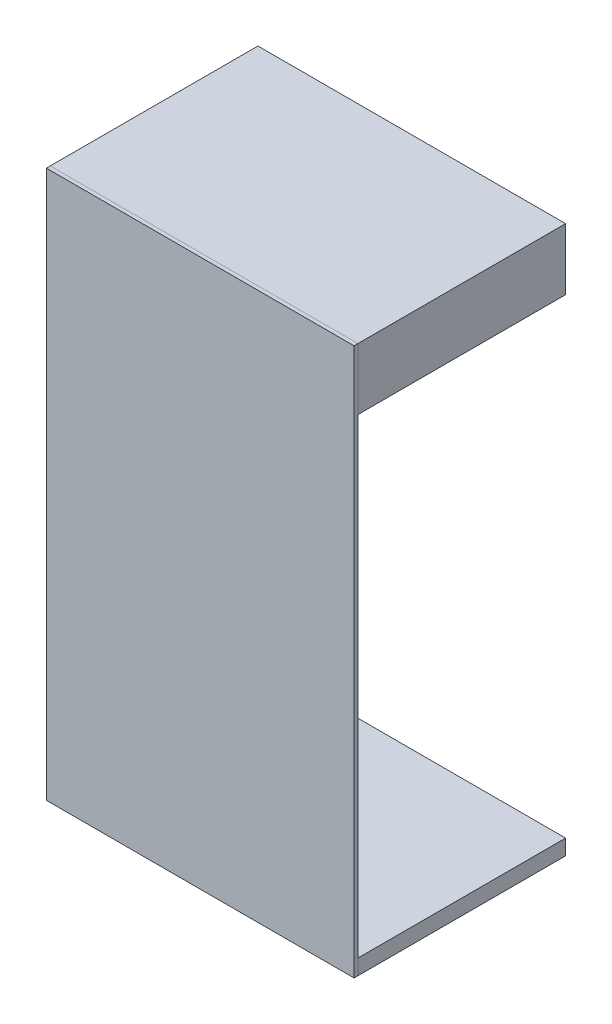
ISO-10303-21;
HEADER;
FILE_DESCRIPTION(('STEP AP214'),'2;1');
FILE_NAME('part.step','',(''),(''),'','','');
FILE_SCHEMA(('AUTOMOTIVE_DESIGN { 1 0 10303 214 1 1 1 1 }'));
ENDSEC;
DATA;
#1=APPLICATION_CONTEXT('core data for automotive mechanical design processes');
#2=APPLICATION_PROTOCOL_DEFINITION('international standard','automotive_design',2000,#1);
#3=PRODUCT_CONTEXT('',#1,'mechanical');
#4=PRODUCT('Part','Part','',(#3));
#5=PRODUCT_RELATED_PRODUCT_CATEGORY('part','',(#4));
#6=PRODUCT_DEFINITION_FORMATION('','',#4);
#7=PRODUCT_DEFINITION_CONTEXT('part definition',#1,'design');
#8=PRODUCT_DEFINITION('design','',#6,#7);
#9=PRODUCT_DEFINITION_SHAPE('','',#8);
#10=(LENGTH_UNIT() NAMED_UNIT(*) SI_UNIT(.MILLI.,.METRE.));
#11=(NAMED_UNIT(*) PLANE_ANGLE_UNIT() SI_UNIT($,.RADIAN.));
#12=(NAMED_UNIT(*) SI_UNIT($,.STERADIAN.) SOLID_ANGLE_UNIT());
#13=UNCERTAINTY_MEASURE_WITH_UNIT(LENGTH_MEASURE(1.E-05),#10,'distance_accuracy_value','');
#14=(GEOMETRIC_REPRESENTATION_CONTEXT(3) GLOBAL_UNCERTAINTY_ASSIGNED_CONTEXT((#13)) GLOBAL_UNIT_ASSIGNED_CONTEXT((#10,
#11,#12)) REPRESENTATION_CONTEXT('',''));
#15=CARTESIAN_POINT('',(0.,0.,0.));
#16=DIRECTION('',(0.,0.,1.));
#17=DIRECTION('',(1.,0.,0.));
#18=AXIS2_PLACEMENT_3D('',#15,#16,#17);
#19=CARTESIAN_POINT('',(-8127.,-800.,-2750.));
#20=DIRECTION('',(0.,1.,0.));
#21=DIRECTION('',(0.,0.,1.));
#22=AXIS2_PLACEMENT_3D('',#19,#20,#21);
#23=PLANE('',#22);
#24=DIRECTION('',(-1.,0.,0.));
#25=VECTOR('',#24,1.);
#26=CARTESIAN_POINT('',(-8127.,-800.,-50.));
#27=LINE('',#26,#25);
#28=CARTESIAN_POINT('',(-8127.,-800.,-50.));
#29=VERTEX_POINT('',#28);
#30=CARTESIAN_POINT('',(-8327.,-800.,-50.));
#31=VERTEX_POINT('',#30);
#32=EDGE_CURVE('E157',#29,#31,#27,.T.);
#33=ORIENTED_EDGE('',*,*,#32,.T.);
#34=DIRECTION('',(0.,0.,1.));
#35=VECTOR('',#34,1.);
#36=CARTESIAN_POINT('',(-8327.,-800.,-2750.));
#37=LINE('',#36,#35);
#38=CARTESIAN_POINT('',(-8327.,-800.,-2750.));
#39=VERTEX_POINT('',#38);
#40=EDGE_CURVE('E12',#39,#31,#37,.T.);
#41=ORIENTED_EDGE('',*,*,#40,.F.);
#42=DIRECTION('',(-1.,0.,0.));
#43=VECTOR('',#42,1.);
#44=CARTESIAN_POINT('',(-8127.,-800.,-2750.));
#45=LINE('',#44,#43);
#46=CARTESIAN_POINT('',(-8127.,-800.,-2750.));
#47=VERTEX_POINT('',#46);
#48=EDGE_CURVE('E175',#47,#39,#45,.T.);
#49=ORIENTED_EDGE('',*,*,#48,.F.);
#50=DIRECTION('',(0.,0.,1.));
#51=VECTOR('',#50,1.);
#52=CARTESIAN_POINT('',(-8127.,-800.,-2750.));
#53=LINE('',#52,#51);
#54=EDGE_CURVE('E153',#47,#29,#53,.T.);
#55=ORIENTED_EDGE('',*,*,#54,.T.);
#56=EDGE_LOOP('',(#33,#41,#49,#55));
#57=FACE_BOUND('',#56,.T.);
#58=ADVANCED_FACE('F49',(#57),#23,.F.);
#59=CARTESIAN_POINT('',(-8327.,-800.,-2750.));
#60=DIRECTION('',(1.,0.,0.));
#61=DIRECTION('',(0.,0.,-1.));
#62=AXIS2_PLACEMENT_3D('',#59,#60,#61);
#63=PLANE('',#62);
#64=DIRECTION('',(0.,1.,0.));
#65=VECTOR('',#64,1.);
#66=CARTESIAN_POINT('',(-8327.,-800.,-50.));
#67=LINE('',#66,#65);
#68=CARTESIAN_POINT('',(-8327.,-200.,-50.));
#69=VERTEX_POINT('',#68);
#70=EDGE_CURVE('E160',#31,#69,#67,.T.);
#71=ORIENTED_EDGE('',*,*,#70,.T.);
#72=DIRECTION('',(0.,0.,1.));
#73=VECTOR('',#72,1.);
#74=CARTESIAN_POINT('',(-8327.,-200.,-2750.));
#75=LINE('',#74,#73);
#76=CARTESIAN_POINT('',(-8327.,-200.,-2750.));
#77=VERTEX_POINT('',#76);
#78=EDGE_CURVE('E57',#77,#69,#75,.T.);
#79=ORIENTED_EDGE('',*,*,#78,.F.);
#80=DIRECTION('',(0.,1.,0.));
#81=VECTOR('',#80,1.);
#82=CARTESIAN_POINT('',(-8327.,-800.,-2750.));
#83=LINE('',#82,#81);
#84=EDGE_CURVE('E114',#39,#77,#83,.T.);
#85=ORIENTED_EDGE('',*,*,#84,.F.);
#86=ORIENTED_EDGE('',*,*,#40,.T.);
#87=EDGE_LOOP('',(#71,#79,#85,#86));
#88=FACE_BOUND('',#87,.T.);
#89=ADVANCED_FACE('F224',(#88),#63,.F.);
#90=CARTESIAN_POINT('',(-8327.,-200.,-2750.));
#91=DIRECTION('',(0.,1.,0.));
#92=DIRECTION('',(0.,0.,1.));
#93=AXIS2_PLACEMENT_3D('',#90,#91,#92);
#94=PLANE('',#93);
#95=DIRECTION('',(-1.,0.,0.));
#96=VECTOR('',#95,1.);
#97=CARTESIAN_POINT('',(-8327.,-200.,-50.));
#98=LINE('',#97,#96);
#99=CARTESIAN_POINT('',(-11927.,-200.,-50.));
#100=VERTEX_POINT('',#99);
#101=EDGE_CURVE('E162',#69,#100,#98,.T.);
#102=ORIENTED_EDGE('',*,*,#101,.T.);
#103=DIRECTION('',(0.,0.,1.));
#104=VECTOR('',#103,1.);
#105=CARTESIAN_POINT('',(-11927.,-200.,-2750.));
#106=LINE('',#105,#104);
#107=CARTESIAN_POINT('',(-11927.,-200.,-2750.));
#108=VERTEX_POINT('',#107);
#109=EDGE_CURVE('E188',#108,#100,#106,.T.);
#110=ORIENTED_EDGE('',*,*,#109,.F.);
#111=DIRECTION('',(-1.,0.,0.));
#112=VECTOR('',#111,1.);
#113=CARTESIAN_POINT('',(-8327.,-200.,-2750.));
#114=LINE('',#113,#112);
#115=EDGE_CURVE('E196',#77,#108,#114,.T.);
#116=ORIENTED_EDGE('',*,*,#115,.F.);
#117=ORIENTED_EDGE('',*,*,#78,.T.);
#118=EDGE_LOOP('',(#102,#110,#116,#117));
#119=FACE_BOUND('',#118,.T.);
#120=ADVANCED_FACE('F194',(#119),#94,.F.);
#121=CARTESIAN_POINT('',(-11927.,-200.,-2750.));
#122=DIRECTION('',(-1.,0.,0.));
#123=DIRECTION('',(0.,0.,1.));
#124=AXIS2_PLACEMENT_3D('',#121,#122,#123);
#125=PLANE('',#124);
#126=DIRECTION('',(0.,-1.,0.));
#127=VECTOR('',#126,1.);
#128=CARTESIAN_POINT('',(-11927.,-200.,-50.));
#129=LINE('',#128,#127);
#130=CARTESIAN_POINT('',(-11927.,-6917.99999999999,-50.));
#131=VERTEX_POINT('',#130);
#132=EDGE_CURVE('E164',#100,#131,#129,.T.);
#133=ORIENTED_EDGE('',*,*,#132,.T.);
#134=DIRECTION('',(0.,0.,1.));
#135=VECTOR('',#134,1.);
#136=CARTESIAN_POINT('',(-11927.,-6917.99999999999,-2750.));
#137=LINE('',#136,#135);
#138=CARTESIAN_POINT('',(-11927.,-6917.99999999999,-2750.));
#139=VERTEX_POINT('',#138);
#140=EDGE_CURVE('E185',#139,#131,#137,.T.);
#141=ORIENTED_EDGE('',*,*,#140,.F.);
#142=DIRECTION('',(0.,-1.,0.));
#143=VECTOR('',#142,1.);
#144=CARTESIAN_POINT('',(-11927.,-200.,-2750.));
#145=LINE('',#144,#143);
#146=EDGE_CURVE('E214',#108,#139,#145,.T.);
#147=ORIENTED_EDGE('',*,*,#146,.F.);
#148=ORIENTED_EDGE('',*,*,#109,.T.);
#149=EDGE_LOOP('',(#133,#141,#147,#148));
#150=FACE_BOUND('',#149,.T.);
#151=ADVANCED_FACE('F205',(#150),#125,.F.);
#152=CARTESIAN_POINT('',(-11927.,-6917.99999999999,-2750.));
#153=DIRECTION('',(0.,-1.,0.));
#154=DIRECTION('',(1.,0.,0.));
#155=AXIS2_PLACEMENT_3D('',#152,#153,#154);
#156=PLANE('',#155);
#157=DIRECTION('',(1.,0.,0.));
#158=VECTOR('',#157,1.);
#159=CARTESIAN_POINT('',(-11927.,-6917.99999999999,-50.));
#160=LINE('',#159,#158);
#161=CARTESIAN_POINT('',(-8127.,-6917.99999999999,-50.));
#162=VERTEX_POINT('',#161);
#163=EDGE_CURVE('E166',#131,#162,#160,.T.);
#164=ORIENTED_EDGE('',*,*,#163,.T.);
#165=DIRECTION('',(0.,0.,1.));
#166=VECTOR('',#165,1.);
#167=CARTESIAN_POINT('',(-8127.,-6917.99999999999,-2750.));
#168=LINE('',#167,#166);
#169=CARTESIAN_POINT('',(-8127.,-6917.99999999999,-2750.));
#170=VERTEX_POINT('',#169);
#171=EDGE_CURVE('E182',#170,#162,#168,.T.);
#172=ORIENTED_EDGE('',*,*,#171,.F.);
#173=DIRECTION('',(1.,0.,0.));
#174=VECTOR('',#173,1.);
#175=CARTESIAN_POINT('',(-11927.,-6917.99999999999,-2750.));
#176=LINE('',#175,#174);
#177=EDGE_CURVE('E211',#139,#170,#176,.T.);
#178=ORIENTED_EDGE('',*,*,#177,.F.);
#179=ORIENTED_EDGE('',*,*,#140,.T.);
#180=EDGE_LOOP('',(#164,#172,#178,#179));
#181=FACE_BOUND('',#180,.T.);
#182=ADVANCED_FACE('F209',(#181),#156,.F.);
#183=CARTESIAN_POINT('',(-8127.,-7117.99999999999,-2750.));
#184=DIRECTION('',(-1.,0.,0.));
#185=DIRECTION('',(0.,0.,1.));
#186=AXIS2_PLACEMENT_3D('',#183,#184,#185);
#187=PLANE('',#186);
#188=DIRECTION('',(0.,-1.,0.));
#189=VECTOR('',#188,1.);
#190=CARTESIAN_POINT('',(-8127.,-7117.99999999999,-50.));
#191=LINE('',#190,#189);
#192=CARTESIAN_POINT('',(-8127.,-7117.99999999999,-50.));
#193=VERTEX_POINT('',#192);
#194=EDGE_CURVE('E168',#162,#193,#191,.T.);
#195=ORIENTED_EDGE('',*,*,#194,.T.);
#196=DIRECTION('',(0.,0.,1.));
#197=VECTOR('',#196,1.);
#198=CARTESIAN_POINT('',(-8127.,-7117.99999999999,-2750.));
#199=LINE('',#198,#197);
#200=CARTESIAN_POINT('',(-8127.,-7117.99999999999,-2750.));
#201=VERTEX_POINT('',#200);
#202=EDGE_CURVE('E179',#201,#193,#199,.T.);
#203=ORIENTED_EDGE('',*,*,#202,.F.);
#204=DIRECTION('',(0.,-1.,0.));
#205=VECTOR('',#204,1.);
#206=CARTESIAN_POINT('',(-8127.,-7117.99999999999,-2750.));
#207=LINE('',#206,#205);
#208=EDGE_CURVE('E213',#170,#201,#207,.T.);
#209=ORIENTED_EDGE('',*,*,#208,.F.);
#210=ORIENTED_EDGE('',*,*,#171,.T.);
#211=EDGE_LOOP('',(#195,#203,#209,#210));
#212=FACE_BOUND('',#211,.T.);
#213=ADVANCED_FACE('F236',(#212),#187,.F.);
#214=CARTESIAN_POINT('',(-12127.,-7117.99999999999,-2750.));
#215=DIRECTION('',(0.,1.,0.));
#216=DIRECTION('',(-1.,0.,0.));
#217=AXIS2_PLACEMENT_3D('',#214,#215,#216);
#218=PLANE('',#217);
#219=DIRECTION('',(-1.,0.,0.));
#220=VECTOR('',#219,1.);
#221=CARTESIAN_POINT('',(-12127.,-7117.99999999999,-50.));
#222=LINE('',#221,#220);
#223=CARTESIAN_POINT('',(-12127.,-7117.99999999999,-50.));
#224=VERTEX_POINT('',#223);
#225=EDGE_CURVE('E170',#193,#224,#222,.T.);
#226=ORIENTED_EDGE('',*,*,#225,.T.);
#227=DIRECTION('',(0.,0.,1.));
#228=VECTOR('',#227,1.);
#229=CARTESIAN_POINT('',(-12127.,-7117.99999999999,-2750.));
#230=LINE('',#229,#228);
#231=CARTESIAN_POINT('',(-12127.,-7117.99999999999,-2750.));
#232=VERTEX_POINT('',#231);
#233=EDGE_CURVE('E148',#232,#224,#230,.T.);
#234=ORIENTED_EDGE('',*,*,#233,.F.);
#235=DIRECTION('',(-1.,0.,0.));
#236=VECTOR('',#235,1.);
#237=CARTESIAN_POINT('',(-12127.,-7117.99999999999,-2750.));
#238=LINE('',#237,#236);
#239=EDGE_CURVE('E139',#201,#232,#238,.T.);
#240=ORIENTED_EDGE('',*,*,#239,.F.);
#241=ORIENTED_EDGE('',*,*,#202,.T.);
#242=EDGE_LOOP('',(#226,#234,#240,#241));
#243=FACE_BOUND('',#242,.T.);
#244=ADVANCED_FACE('F239',(#243),#218,.F.);
#245=CARTESIAN_POINT('',(-12127.,-4.89842541528951E-13,-2750.));
#246=DIRECTION('',(1.,0.,0.));
#247=DIRECTION('',(0.,0.,-1.));
#248=AXIS2_PLACEMENT_3D('',#245,#246,#247);
#249=PLANE('',#248);
#250=DIRECTION('',(0.,1.,0.));
#251=VECTOR('',#250,1.);
#252=CARTESIAN_POINT('',(-12127.,-4.89842541528951E-13,-50.));
#253=LINE('',#252,#251);
#254=CARTESIAN_POINT('',(-12127.,-4.89842541528951E-13,-50.));
#255=VERTEX_POINT('',#254);
#256=EDGE_CURVE('E147',#224,#255,#253,.T.);
#257=ORIENTED_EDGE('',*,*,#256,.T.);
#258=DIRECTION('',(0.,0.,1.));
#259=VECTOR('',#258,1.);
#260=CARTESIAN_POINT('',(-12127.,-4.89842541528951E-13,-2750.));
#261=LINE('',#260,#259);
#262=CARTESIAN_POINT('',(-12127.,-4.89842541528951E-13,-2750.));
#263=VERTEX_POINT('',#262);
#264=EDGE_CURVE('E144',#263,#255,#261,.T.);
#265=ORIENTED_EDGE('',*,*,#264,.F.);
#266=DIRECTION('',(0.,1.,0.));
#267=VECTOR('',#266,1.);
#268=CARTESIAN_POINT('',(-12127.,-4.89842541528951E-13,-2750.));
#269=LINE('',#268,#267);
#270=EDGE_CURVE('E133',#232,#263,#269,.T.);
#271=ORIENTED_EDGE('',*,*,#270,.F.);
#272=ORIENTED_EDGE('',*,*,#233,.T.);
#273=EDGE_LOOP('',(#257,#265,#271,#272));
#274=FACE_BOUND('',#273,.T.);
#275=ADVANCED_FACE('F145',(#274),#249,.F.);
#276=CARTESIAN_POINT('',(-8127.,0.,-2750.));
#277=DIRECTION('',(0.,-1.,0.));
#278=DIRECTION('',(1.,0.,0.));
#279=AXIS2_PLACEMENT_3D('',#276,#277,#278);
#280=PLANE('',#279);
#281=DIRECTION('',(1.,0.,0.));
#282=VECTOR('',#281,1.);
#283=CARTESIAN_POINT('',(-8127.,0.,-50.));
#284=LINE('',#283,#282);
#285=CARTESIAN_POINT('',(-8127.,0.,-50.));
#286=VERTEX_POINT('',#285);
#287=EDGE_CURVE('E100',#255,#286,#284,.T.);
#288=ORIENTED_EDGE('',*,*,#287,.T.);
#289=DIRECTION('',(0.,0.,1.));
#290=VECTOR('',#289,1.);
#291=CARTESIAN_POINT('',(-8127.,0.,-2750.));
#292=LINE('',#291,#290);
#293=CARTESIAN_POINT('',(-8127.,0.,-2750.));
#294=VERTEX_POINT('',#293);
#295=EDGE_CURVE('E149',#294,#286,#292,.T.);
#296=ORIENTED_EDGE('',*,*,#295,.F.);
#297=DIRECTION('',(1.,0.,0.));
#298=VECTOR('',#297,1.);
#299=CARTESIAN_POINT('',(-8127.,0.,-2750.));
#300=LINE('',#299,#298);
#301=EDGE_CURVE('E137',#263,#294,#300,.T.);
#302=ORIENTED_EDGE('',*,*,#301,.F.);
#303=ORIENTED_EDGE('',*,*,#264,.T.);
#304=EDGE_LOOP('',(#288,#296,#302,#303));
#305=FACE_BOUND('',#304,.T.);
#306=ADVANCED_FACE('F151',(#305),#280,.F.);
#307=CARTESIAN_POINT('',(-8127.,-800.,-2750.));
#308=DIRECTION('',(-1.,0.,0.));
#309=DIRECTION('',(0.,0.,1.));
#310=AXIS2_PLACEMENT_3D('',#307,#308,#309);
#311=PLANE('',#310);
#312=DIRECTION('',(0.,-1.,0.));
#313=VECTOR('',#312,1.);
#314=CARTESIAN_POINT('',(-8127.,-800.,-50.));
#315=LINE('',#314,#313);
#316=EDGE_CURVE('E106',#286,#29,#315,.T.);
#317=ORIENTED_EDGE('',*,*,#316,.T.);
#318=ORIENTED_EDGE('',*,*,#54,.F.);
#319=DIRECTION('',(0.,-1.,0.));
#320=VECTOR('',#319,1.);
#321=CARTESIAN_POINT('',(-8127.,-800.,-2750.));
#322=LINE('',#321,#320);
#323=EDGE_CURVE('E65',#294,#47,#322,.T.);
#324=ORIENTED_EDGE('',*,*,#323,.F.);
#325=ORIENTED_EDGE('',*,*,#295,.T.);
#326=EDGE_LOOP('',(#317,#318,#324,#325));
#327=FACE_BOUND('',#326,.T.);
#328=ADVANCED_FACE('F248',(#327),#311,.F.);
#329=CARTESIAN_POINT('',(0.,0.,-2750.));
#330=DIRECTION('',(0.,0.,-1.));
#331=DIRECTION('',(-1.,0.,0.));
#332=AXIS2_PLACEMENT_3D('',#329,#330,#331);
#333=PLANE('',#332);
#334=ORIENTED_EDGE('',*,*,#48,.T.);
#335=ORIENTED_EDGE('',*,*,#84,.T.);
#336=ORIENTED_EDGE('',*,*,#115,.T.);
#337=ORIENTED_EDGE('',*,*,#146,.T.);
#338=ORIENTED_EDGE('',*,*,#177,.T.);
#339=ORIENTED_EDGE('',*,*,#208,.T.);
#340=ORIENTED_EDGE('',*,*,#239,.T.);
#341=ORIENTED_EDGE('',*,*,#270,.T.);
#342=ORIENTED_EDGE('',*,*,#301,.T.);
#343=ORIENTED_EDGE('',*,*,#323,.T.);
#344=EDGE_LOOP('',(#334,#335,#336,#337,#338,#339,#340,#341,#342,#343));
#345=FACE_BOUND('',#344,.T.);
#346=ADVANCED_FACE('F135',(#345),#333,.T.);
#347=CARTESIAN_POINT('',(0.,0.,-50.));
#348=DIRECTION('',(0.,0.,-1.));
#349=DIRECTION('',(-1.,0.,0.));
#350=AXIS2_PLACEMENT_3D('',#347,#348,#349);
#351=PLANE('',#350);
#352=ORIENTED_EDGE('',*,*,#32,.F.);
#353=ORIENTED_EDGE('',*,*,#316,.F.);
#354=ORIENTED_EDGE('',*,*,#287,.F.);
#355=ORIENTED_EDGE('',*,*,#256,.F.);
#356=ORIENTED_EDGE('',*,*,#225,.F.);
#357=ORIENTED_EDGE('',*,*,#194,.F.);
#358=ORIENTED_EDGE('',*,*,#163,.F.);
#359=ORIENTED_EDGE('',*,*,#132,.F.);
#360=ORIENTED_EDGE('',*,*,#101,.F.);
#361=ORIENTED_EDGE('',*,*,#70,.F.);
#362=EDGE_LOOP('',(#352,#353,#354,#355,#356,#357,#358,#359,#360,#361));
#363=FACE_BOUND('',#362,.T.);
#364=ADVANCED_FACE('F200',(#363),#351,.F.);
#365=CLOSED_SHELL('',(#58,#89,#120,#151,#182,#213,#244,#275,#306,#328,#346,#364));
#366=MANIFOLD_SOLID_BREP('B2',#365);
#367=CARTESIAN_POINT('',(-8127.,-7117.99999999999,-50.));
#368=DIRECTION('',(0.,1.,0.));
#369=DIRECTION('',(-1.,0.,0.));
#370=AXIS2_PLACEMENT_3D('',#367,#368,#369);
#371=PLANE('',#370);
#372=DIRECTION('',(-1.,0.,0.));
#373=VECTOR('',#372,1.);
#374=CARTESIAN_POINT('',(-8127.,-7117.99999999999,0.));
#375=LINE('',#374,#373);
#376=CARTESIAN_POINT('',(-8127.,-7117.99999999999,0.));
#377=VERTEX_POINT('',#376);
#378=CARTESIAN_POINT('',(-12127.,-7117.99999999999,0.));
#379=VERTEX_POINT('',#378);
#380=EDGE_CURVE('E391',#377,#379,#375,.T.);
#381=ORIENTED_EDGE('',*,*,#380,.T.);
#382=DIRECTION('',(0.,0.,1.));
#383=VECTOR('',#382,1.);
#384=CARTESIAN_POINT('',(-12127.,-7117.99999999999,-50.));
#385=LINE('',#384,#383);
#386=CARTESIAN_POINT('',(-12127.,-7117.99999999999,-50.));
#387=VERTEX_POINT('',#386);
#388=EDGE_CURVE('E47',#387,#379,#385,.T.);
#389=ORIENTED_EDGE('',*,*,#388,.F.);
#390=DIRECTION('',(-1.,0.,0.));
#391=VECTOR('',#390,1.);
#392=CARTESIAN_POINT('',(-8127.,-7117.99999999999,-50.));
#393=LINE('',#392,#391);
#394=CARTESIAN_POINT('',(-8127.,-7117.99999999999,-50.));
#395=VERTEX_POINT('',#394);
#396=EDGE_CURVE('E377',#395,#387,#393,.T.);
#397=ORIENTED_EDGE('',*,*,#396,.F.);
#398=DIRECTION('',(0.,0.,1.));
#399=VECTOR('',#398,1.);
#400=CARTESIAN_POINT('',(-8127.,-7117.99999999999,-50.));
#401=LINE('',#400,#399);
#402=EDGE_CURVE('E344',#395,#377,#401,.T.);
#403=ORIENTED_EDGE('',*,*,#402,.T.);
#404=EDGE_LOOP('',(#381,#389,#397,#403));
#405=FACE_BOUND('',#404,.T.);
#406=ADVANCED_FACE('F328',(#405),#371,.F.);
#407=CARTESIAN_POINT('',(-12127.,-7117.99999999999,-50.));
#408=DIRECTION('',(1.,0.,0.));
#409=DIRECTION('',(0.,0.,-1.));
#410=AXIS2_PLACEMENT_3D('',#407,#408,#409);
#411=PLANE('',#410);
#412=DIRECTION('',(0.,1.,0.));
#413=VECTOR('',#412,1.);
#414=CARTESIAN_POINT('',(-12127.,-7117.99999999999,0.));
#415=LINE('',#414,#413);
#416=CARTESIAN_POINT('',(-12127.,-4.89842541528951E-13,0.));
#417=VERTEX_POINT('',#416);
#418=EDGE_CURVE('E382',#379,#417,#415,.T.);
#419=ORIENTED_EDGE('',*,*,#418,.T.);
#420=DIRECTION('',(0.,0.,1.));
#421=VECTOR('',#420,1.);
#422=CARTESIAN_POINT('',(-12127.,-4.89842541528951E-13,-50.));
#423=LINE('',#422,#421);
#424=CARTESIAN_POINT('',(-12127.,-4.89842541528951E-13,-50.));
#425=VERTEX_POINT('',#424);
#426=EDGE_CURVE('E336',#425,#417,#423,.T.);
#427=ORIENTED_EDGE('',*,*,#426,.F.);
#428=DIRECTION('',(0.,1.,0.));
#429=VECTOR('',#428,1.);
#430=CARTESIAN_POINT('',(-12127.,-7117.99999999999,-50.));
#431=LINE('',#430,#429);
#432=EDGE_CURVE('E369',#387,#425,#431,.T.);
#433=ORIENTED_EDGE('',*,*,#432,.F.);
#434=ORIENTED_EDGE('',*,*,#388,.T.);
#435=EDGE_LOOP('',(#419,#427,#433,#434));
#436=FACE_BOUND('',#435,.T.);
#437=ADVANCED_FACE('F381',(#436),#411,.F.);
#438=CARTESIAN_POINT('',(-8127.,0.,-50.));
#439=DIRECTION('',(0.,1.,0.));
#440=DIRECTION('',(-1.,0.,0.));
#441=AXIS2_PLACEMENT_3D('',#438,#439,#440);
#442=PLANE('',#441);
#443=DIRECTION('',(-1.,0.,0.));
#444=VECTOR('',#443,1.);
#445=CARTESIAN_POINT('',(-8127.,0.,0.));
#446=LINE('',#445,#444);
#447=CARTESIAN_POINT('',(-8127.,0.,0.));
#448=VERTEX_POINT('',#447);
#449=EDGE_CURVE('E394',#448,#417,#446,.T.);
#450=ORIENTED_EDGE('',*,*,#449,.F.);
#451=DIRECTION('',(0.,0.,1.));
#452=VECTOR('',#451,1.);
#453=CARTESIAN_POINT('',(-8127.,0.,-50.));
#454=LINE('',#453,#452);
#455=CARTESIAN_POINT('',(-8127.,0.,-50.));
#456=VERTEX_POINT('',#455);
#457=EDGE_CURVE('E358',#456,#448,#454,.T.);
#458=ORIENTED_EDGE('',*,*,#457,.F.);
#459=DIRECTION('',(-1.,0.,0.));
#460=VECTOR('',#459,1.);
#461=CARTESIAN_POINT('',(-8127.,0.,-50.));
#462=LINE('',#461,#460);
#463=EDGE_CURVE('E376',#456,#425,#462,.T.);
#464=ORIENTED_EDGE('',*,*,#463,.T.);
#465=ORIENTED_EDGE('',*,*,#426,.T.);
#466=EDGE_LOOP('',(#450,#458,#464,#465));
#467=FACE_BOUND('',#466,.T.);
#468=ADVANCED_FACE('F385',(#467),#442,.T.);
#469=CARTESIAN_POINT('',(-8127.,-7117.99999999999,-50.));
#470=DIRECTION('',(1.,0.,0.));
#471=DIRECTION('',(0.,0.,-1.));
#472=AXIS2_PLACEMENT_3D('',#469,#470,#471);
#473=PLANE('',#472);
#474=DIRECTION('',(0.,1.,0.));
#475=VECTOR('',#474,1.);
#476=CARTESIAN_POINT('',(-8127.,-7117.99999999999,0.));
#477=LINE('',#476,#475);
#478=EDGE_CURVE('E396',#377,#448,#477,.T.);
#479=ORIENTED_EDGE('',*,*,#478,.F.);
#480=ORIENTED_EDGE('',*,*,#402,.F.);
#481=DIRECTION('',(0.,1.,0.));
#482=VECTOR('',#481,1.);
#483=CARTESIAN_POINT('',(-8127.,-7117.99999999999,-50.));
#484=LINE('',#483,#482);
#485=EDGE_CURVE('E386',#395,#456,#484,.T.);
#486=ORIENTED_EDGE('',*,*,#485,.T.);
#487=ORIENTED_EDGE('',*,*,#457,.T.);
#488=EDGE_LOOP('',(#479,#480,#486,#487));
#489=FACE_BOUND('',#488,.T.);
#490=ADVANCED_FACE('F402',(#489),#473,.T.);
#491=CARTESIAN_POINT('',(0.,0.,-50.));
#492=DIRECTION('',(0.,0.,-1.));
#493=DIRECTION('',(-1.,0.,0.));
#494=AXIS2_PLACEMENT_3D('',#491,#492,#493);
#495=PLANE('',#494);
#496=ORIENTED_EDGE('',*,*,#396,.T.);
#497=ORIENTED_EDGE('',*,*,#432,.T.);
#498=ORIENTED_EDGE('',*,*,#463,.F.);
#499=ORIENTED_EDGE('',*,*,#485,.F.);
#500=EDGE_LOOP('',(#496,#497,#498,#499));
#501=FACE_BOUND('',#500,.T.);
#502=ADVANCED_FACE('F373',(#501),#495,.T.);
#503=CARTESIAN_POINT('',(0.,0.,0.));
#504=DIRECTION('',(0.,0.,-1.));
#505=DIRECTION('',(-1.,0.,0.));
#506=AXIS2_PLACEMENT_3D('',#503,#504,#505);
#507=PLANE('',#506);
#508=ORIENTED_EDGE('',*,*,#380,.F.);
#509=ORIENTED_EDGE('',*,*,#478,.T.);
#510=ORIENTED_EDGE('',*,*,#449,.T.);
#511=ORIENTED_EDGE('',*,*,#418,.F.);
#512=EDGE_LOOP('',(#508,#509,#510,#511));
#513=FACE_BOUND('',#512,.T.);
#514=ADVANCED_FACE('F401',(#513),#507,.F.);
#515=CLOSED_SHELL('',(#406,#437,#468,#490,#502,#514));
#516=MANIFOLD_SOLID_BREP('B6',#515);
#517=ADVANCED_BREP_SHAPE_REPRESENTATION('',(#18,#366,#516),#14);
#518=SHAPE_DEFINITION_REPRESENTATION(#9,#517);
ENDSEC;
END-ISO-10303-21;
